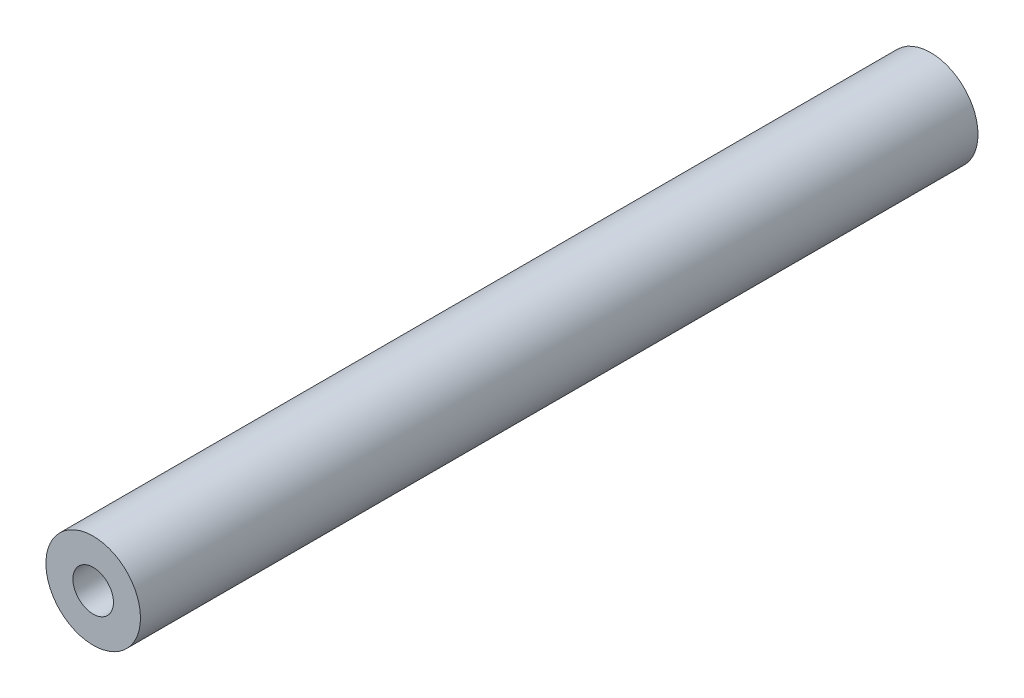
ISO-10303-21;
HEADER;
FILE_DESCRIPTION(('STEP AP214'),'2;1');
FILE_NAME('part.step','',(''),(''),'','','');
FILE_SCHEMA(('AUTOMOTIVE_DESIGN { 1 0 10303 214 1 1 1 1 }'));
ENDSEC;
DATA;
#1=APPLICATION_CONTEXT('core data for automotive mechanical design processes');
#2=APPLICATION_PROTOCOL_DEFINITION('international standard','automotive_design',2000,#1);
#3=PRODUCT_CONTEXT('',#1,'mechanical');
#4=PRODUCT('Part','Part','',(#3));
#5=PRODUCT_RELATED_PRODUCT_CATEGORY('part','',(#4));
#6=PRODUCT_DEFINITION_FORMATION('','',#4);
#7=PRODUCT_DEFINITION_CONTEXT('part definition',#1,'design');
#8=PRODUCT_DEFINITION('design','',#6,#7);
#9=PRODUCT_DEFINITION_SHAPE('','',#8);
#10=(LENGTH_UNIT() NAMED_UNIT(*) SI_UNIT(.MILLI.,.METRE.));
#11=(NAMED_UNIT(*) PLANE_ANGLE_UNIT() SI_UNIT($,.RADIAN.));
#12=(NAMED_UNIT(*) SI_UNIT($,.STERADIAN.) SOLID_ANGLE_UNIT());
#13=UNCERTAINTY_MEASURE_WITH_UNIT(LENGTH_MEASURE(1.E-05),#10,'distance_accuracy_value','');
#14=(GEOMETRIC_REPRESENTATION_CONTEXT(3) GLOBAL_UNCERTAINTY_ASSIGNED_CONTEXT((#13)) GLOBAL_UNIT_ASSIGNED_CONTEXT((#10,
#11,#12)) REPRESENTATION_CONTEXT('',''));
#15=CARTESIAN_POINT('',(0.,0.,0.));
#16=DIRECTION('',(0.,0.,1.));
#17=DIRECTION('',(1.,0.,0.));
#18=AXIS2_PLACEMENT_3D('',#15,#16,#17);
#19=CARTESIAN_POINT('',(0.,0.,62.));
#20=DIRECTION('',(0.,0.,1.));
#21=DIRECTION('',(1.,0.,0.));
#22=AXIS2_PLACEMENT_3D('',#19,#20,#21);
#23=PLANE('',#22);
#24=CARTESIAN_POINT('',(0.,0.,62.));
#25=DIRECTION('',(0.,0.,1.));
#26=DIRECTION('',(1.,0.,0.));
#27=AXIS2_PLACEMENT_3D('',#24,#25,#26);
#28=CIRCLE('',#27,3.5);
#29=CARTESIAN_POINT('',(3.5,0.,62.));
#30=VERTEX_POINT('',#29);
#31=EDGE_CURVE('E10',#30,#30,#28,.T.);
#32=ORIENTED_EDGE('',*,*,#31,.T.);
#33=EDGE_LOOP('',(#32));
#34=FACE_BOUND('',#33,.T.);
#35=CARTESIAN_POINT('',(0.,0.,62.));
#36=DIRECTION('',(0.,0.,1.));
#37=DIRECTION('',(1.,0.,0.));
#38=AXIS2_PLACEMENT_3D('',#35,#36,#37);
#39=CIRCLE('',#38,1.5);
#40=CARTESIAN_POINT('',(1.5,0.,62.));
#41=VERTEX_POINT('',#40);
#42=EDGE_CURVE('E46',#41,#41,#39,.T.);
#43=ORIENTED_EDGE('',*,*,#42,.F.);
#44=EDGE_LOOP('',(#43));
#45=FACE_BOUND('',#44,.T.);
#46=ADVANCED_FACE('F35',(#34,#45),#23,.T.);
#47=CARTESIAN_POINT('',(0.,0.,0.));
#48=DIRECTION('',(0.,0.,1.));
#49=DIRECTION('',(1.,0.,0.));
#50=AXIS2_PLACEMENT_3D('',#47,#48,#49);
#51=PLANE('',#50);
#52=CARTESIAN_POINT('',(0.,0.,0.));
#53=DIRECTION('',(0.,0.,1.));
#54=DIRECTION('',(1.,0.,0.));
#55=AXIS2_PLACEMENT_3D('',#52,#53,#54);
#56=CIRCLE('',#55,3.5);
#57=CARTESIAN_POINT('',(3.5,0.,0.));
#58=VERTEX_POINT('',#57);
#59=EDGE_CURVE('E39',#58,#58,#56,.T.);
#60=ORIENTED_EDGE('',*,*,#59,.F.);
#61=EDGE_LOOP('',(#60));
#62=FACE_BOUND('',#61,.T.);
#63=CARTESIAN_POINT('',(0.,0.,0.));
#64=DIRECTION('',(0.,0.,1.));
#65=DIRECTION('',(1.,0.,0.));
#66=AXIS2_PLACEMENT_3D('',#63,#64,#65);
#67=CIRCLE('',#66,1.5);
#68=CARTESIAN_POINT('',(1.5,0.,0.));
#69=VERTEX_POINT('',#68);
#70=EDGE_CURVE('E48',#69,#69,#67,.T.);
#71=ORIENTED_EDGE('',*,*,#70,.T.);
#72=EDGE_LOOP('',(#71));
#73=FACE_BOUND('',#72,.T.);
#74=ADVANCED_FACE('F58',(#62,#73),#51,.F.);
#75=CARTESIAN_POINT('',(0.,0.,62.));
#76=DIRECTION('',(0.,0.,-1.));
#77=DIRECTION('',(-1.,0.,0.));
#78=AXIS2_PLACEMENT_3D('',#75,#76,#77);
#79=CYLINDRICAL_SURFACE('',#78,3.5);
#80=ORIENTED_EDGE('',*,*,#31,.F.);
#81=EDGE_LOOP('',(#80));
#82=FACE_BOUND('',#81,.T.);
#83=ORIENTED_EDGE('',*,*,#59,.T.);
#84=EDGE_LOOP('',(#83));
#85=FACE_BOUND('',#84,.T.);
#86=ADVANCED_FACE('F37',(#82,#85),#79,.T.);
#87=CARTESIAN_POINT('',(0.,0.,62.));
#88=DIRECTION('',(0.,0.,-1.));
#89=DIRECTION('',(-1.,0.,0.));
#90=AXIS2_PLACEMENT_3D('',#87,#88,#89);
#91=CYLINDRICAL_SURFACE('',#90,1.5);
#92=ORIENTED_EDGE('',*,*,#42,.T.);
#93=EDGE_LOOP('',(#92));
#94=FACE_BOUND('',#93,.T.);
#95=ORIENTED_EDGE('',*,*,#70,.F.);
#96=EDGE_LOOP('',(#95));
#97=FACE_BOUND('',#96,.T.);
#98=ADVANCED_FACE('F54',(#94,#97),#91,.F.);
#99=CLOSED_SHELL('',(#46,#74,#86,#98));
#100=MANIFOLD_SOLID_BREP('B2',#99);
#101=ADVANCED_BREP_SHAPE_REPRESENTATION('',(#18,#100),#14);
#102=SHAPE_DEFINITION_REPRESENTATION(#9,#101);
ENDSEC;
END-ISO-10303-21;
